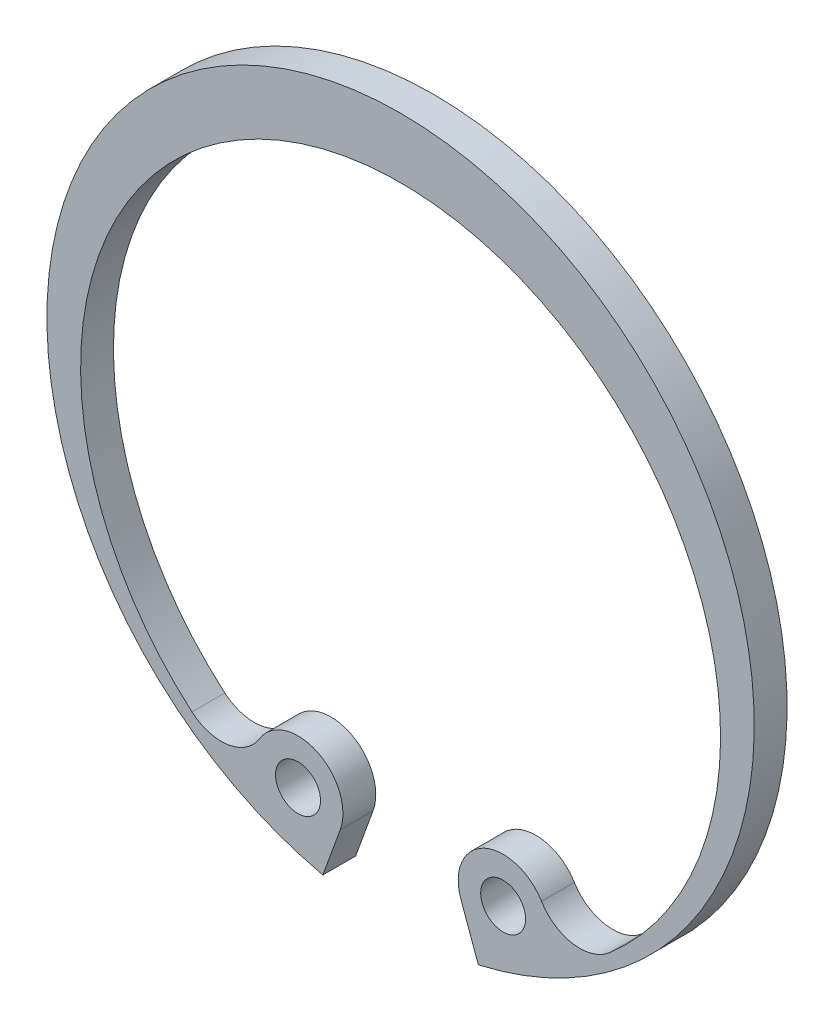
ISO-10303-21;
HEADER;
FILE_DESCRIPTION(('STEP AP214'),'2;1');
FILE_NAME('part.step','',(''),(''),'','','');
FILE_SCHEMA(('AUTOMOTIVE_DESIGN { 1 0 10303 214 1 1 1 1 }'));
ENDSEC;
DATA;
#1=APPLICATION_CONTEXT('core data for automotive mechanical design processes');
#2=APPLICATION_PROTOCOL_DEFINITION('international standard','automotive_design',2000,#1);
#3=PRODUCT_CONTEXT('',#1,'mechanical');
#4=PRODUCT('Part','Part','',(#3));
#5=PRODUCT_RELATED_PRODUCT_CATEGORY('part','',(#4));
#6=PRODUCT_DEFINITION_FORMATION('','',#4);
#7=PRODUCT_DEFINITION_CONTEXT('part definition',#1,'design');
#8=PRODUCT_DEFINITION('design','',#6,#7);
#9=PRODUCT_DEFINITION_SHAPE('','',#8);
#10=(LENGTH_UNIT() NAMED_UNIT(*) SI_UNIT(.MILLI.,.METRE.));
#11=(NAMED_UNIT(*) PLANE_ANGLE_UNIT() SI_UNIT($,.RADIAN.));
#12=(NAMED_UNIT(*) SI_UNIT($,.STERADIAN.) SOLID_ANGLE_UNIT());
#13=UNCERTAINTY_MEASURE_WITH_UNIT(LENGTH_MEASURE(1.E-05),#10,'distance_accuracy_value','');
#14=(GEOMETRIC_REPRESENTATION_CONTEXT(3) GLOBAL_UNCERTAINTY_ASSIGNED_CONTEXT((#13)) GLOBAL_UNIT_ASSIGNED_CONTEXT((#10,
#11,#12)) REPRESENTATION_CONTEXT('',''));
#15=CARTESIAN_POINT('',(0.,0.,0.));
#16=DIRECTION('',(0.,0.,1.));
#17=DIRECTION('',(1.,0.,0.));
#18=AXIS2_PLACEMENT_3D('',#15,#16,#17);
#19=CARTESIAN_POINT('',(0.,0.,0.975));
#20=DIRECTION('',(0.,0.,-1.));
#21=DIRECTION('',(-1.,0.,0.));
#22=AXIS2_PLACEMENT_3D('',#19,#20,#21);
#23=CYLINDRICAL_SURFACE('',#22,10.5);
#24=CARTESIAN_POINT('',(0.,0.,0.975));
#25=DIRECTION('',(0.,0.,-1.));
#26=DIRECTION('',(-1.,0.,0.));
#27=AXIS2_PLACEMENT_3D('',#24,#25,#26);
#28=CIRCLE('',#27,10.5);
#29=CARTESIAN_POINT('',(-2.30921625274565,-10.2429253779404,0.975));
#30=VERTEX_POINT('',#29);
#31=CARTESIAN_POINT('',(2.30921625274565,-10.2429253779404,0.975));
#32=VERTEX_POINT('',#31);
#33=EDGE_CURVE('E49',#30,#32,#28,.T.);
#34=ORIENTED_EDGE('',*,*,#33,.F.);
#35=DIRECTION('',(0.,0.,-1.));
#36=VECTOR('',#35,1.);
#37=CARTESIAN_POINT('',(-2.30921625274565,-10.2429253779404,1.95));
#38=LINE('',#37,#36);
#39=CARTESIAN_POINT('',(-2.30921625274565,-10.2429253779404,1.95));
#40=VERTEX_POINT('',#39);
#41=EDGE_CURVE('E11',#40,#30,#38,.T.);
#42=ORIENTED_EDGE('',*,*,#41,.F.);
#43=CARTESIAN_POINT('',(0.,0.,1.95));
#44=DIRECTION('',(0.,0.,1.));
#45=DIRECTION('',(1.,0.,0.));
#46=AXIS2_PLACEMENT_3D('',#43,#44,#45);
#47=CIRCLE('',#46,10.5);
#48=CARTESIAN_POINT('',(2.30921625274565,-10.2429253779404,1.95));
#49=VERTEX_POINT('',#48);
#50=EDGE_CURVE('E118',#49,#40,#47,.T.);
#51=ORIENTED_EDGE('',*,*,#50,.F.);
#52=DIRECTION('',(0.,0.,-1.));
#53=VECTOR('',#52,1.);
#54=CARTESIAN_POINT('',(2.30921625274565,-10.2429253779404,1.95));
#55=LINE('',#54,#53);
#56=EDGE_CURVE('E111',#49,#32,#55,.T.);
#57=ORIENTED_EDGE('',*,*,#56,.T.);
#58=EDGE_LOOP('',(#34,#42,#51,#57));
#59=FACE_BOUND('',#58,.T.);
#60=ADVANCED_FACE('F33',(#59),#23,.T.);
#61=CARTESIAN_POINT('',(0.,0.,1.95));
#62=DIRECTION('',(0.,0.,1.));
#63=DIRECTION('',(1.,0.,0.));
#64=AXIS2_PLACEMENT_3D('',#61,#62,#63);
#65=PLANE('',#64);
#66=CARTESIAN_POINT('',(3.04471087596214,-8.36527438047387,1.95));
#67=DIRECTION('',(0.,0.,1.));
#68=DIRECTION('',(1.,0.,0.));
#69=AXIS2_PLACEMENT_3D('',#66,#67,#68);
#70=CIRCLE('',#69,0.666666666666667);
#71=CARTESIAN_POINT('',(3.71137754262881,-8.36527438047387,1.95));
#72=VERTEX_POINT('',#71);
#73=EDGE_CURVE('E105',#72,#72,#70,.T.);
#74=ORIENTED_EDGE('',*,*,#73,.F.);
#75=EDGE_LOOP('',(#74));
#76=FACE_BOUND('',#75,.T.);
#77=ORIENTED_EDGE('',*,*,#50,.T.);
#78=DIRECTION('',(0.342020143325669,0.939692620785908,0.));
#79=VECTOR('',#78,1.);
#80=CARTESIAN_POINT('',(-1.79178738158093,-8.82130123824143,1.95));
#81=LINE('',#80,#79);
#82=CARTESIAN_POINT('',(-1.79178738158093,-8.82130123824143,1.95));
#83=VERTEX_POINT('',#82);
#84=EDGE_CURVE('E115',#40,#83,#81,.T.);
#85=ORIENTED_EDGE('',*,*,#84,.T.);
#86=CARTESIAN_POINT('',(-3.04471087596214,-8.36527438047387,1.95));
#87=DIRECTION('',(0.,0.,1.));
#88=DIRECTION('',(1.,0.,0.));
#89=AXIS2_PLACEMENT_3D('',#86,#87,#88);
#90=CIRCLE('',#89,1.33333333333333);
#91=CARTESIAN_POINT('',(-4.18415582842588,-7.67285617008172,1.95));
#92=VERTEX_POINT('',#91);
#93=EDGE_CURVE('E117',#83,#92,#90,.T.);
#94=ORIENTED_EDGE('',*,*,#93,.T.);
#95=CARTESIAN_POINT('',(-5.32360078088962,-6.98043795968956,1.95));
#96=DIRECTION('',(0.,0.,-1.));
#97=DIRECTION('',(1.,0.,0.));
#98=AXIS2_PLACEMENT_3D('',#95,#96,#97);
#99=CIRCLE('',#98,1.33333333333333);
#100=CARTESIAN_POINT('',(-6.19276009205528,-7.99154619800622,1.95));
#101=VERTEX_POINT('',#100);
#102=EDGE_CURVE('E130',#92,#101,#99,.T.);
#103=ORIENTED_EDGE('',*,*,#102,.T.);
#104=CARTESIAN_POINT('',(0.,-0.7874,1.95));
#105=DIRECTION('',(0.,0.,-1.));
#106=DIRECTION('',(1.,0.,0.));
#107=AXIS2_PLACEMENT_3D('',#104,#105,#106);
#108=CIRCLE('',#107,9.5);
#109=CARTESIAN_POINT('',(6.19276009205528,-7.99154619800622,1.95));
#110=VERTEX_POINT('',#109);
#111=EDGE_CURVE('E132',#101,#110,#108,.T.);
#112=ORIENTED_EDGE('',*,*,#111,.T.);
#113=CARTESIAN_POINT('',(5.32360078088963,-6.98043795968956,1.95));
#114=DIRECTION('',(0.,0.,-1.));
#115=DIRECTION('',(-1.,0.,0.));
#116=AXIS2_PLACEMENT_3D('',#113,#114,#115);
#117=CIRCLE('',#116,1.33333333333333);
#118=CARTESIAN_POINT('',(4.18415582842589,-7.67285617008171,1.95));
#119=VERTEX_POINT('',#118);
#120=EDGE_CURVE('E134',#110,#119,#117,.T.);
#121=ORIENTED_EDGE('',*,*,#120,.T.);
#122=CARTESIAN_POINT('',(3.04471087596214,-8.36527438047387,1.95));
#123=DIRECTION('',(0.,0.,1.));
#124=DIRECTION('',(-1.,0.,0.));
#125=AXIS2_PLACEMENT_3D('',#122,#123,#124);
#126=CIRCLE('',#125,1.33333333333333);
#127=CARTESIAN_POINT('',(1.79178738158093,-8.82130123824143,1.95));
#128=VERTEX_POINT('',#127);
#129=EDGE_CURVE('E136',#119,#128,#126,.T.);
#130=ORIENTED_EDGE('',*,*,#129,.T.);
#131=DIRECTION('',(0.34202014332567,-0.939692620785908,0.));
#132=VECTOR('',#131,1.);
#133=CARTESIAN_POINT('',(1.79178738158093,-8.82130123824143,1.95));
#134=LINE('',#133,#132);
#135=EDGE_CURVE('E57',#128,#49,#134,.T.);
#136=ORIENTED_EDGE('',*,*,#135,.T.);
#137=EDGE_LOOP('',(#77,#85,#94,#103,#112,#121,#130,#136));
#138=FACE_BOUND('',#137,.T.);
#139=CARTESIAN_POINT('',(-3.04471087596214,-8.36527438047387,1.95));
#140=DIRECTION('',(0.,0.,1.));
#141=DIRECTION('',(1.,0.,0.));
#142=AXIS2_PLACEMENT_3D('',#139,#140,#141);
#143=CIRCLE('',#142,0.666666666666667);
#144=CARTESIAN_POINT('',(-2.37804420929548,-8.36527438047387,1.95));
#145=VERTEX_POINT('',#144);
#146=EDGE_CURVE('E229',#145,#145,#143,.T.);
#147=ORIENTED_EDGE('',*,*,#146,.F.);
#148=EDGE_LOOP('',(#147));
#149=FACE_BOUND('',#148,.T.);
#150=ADVANCED_FACE('F120',(#76,#138,#149),#65,.T.);
#151=CARTESIAN_POINT('',(-1.79178738158093,-8.82130123824143,1.95));
#152=DIRECTION('',(-0.939692620785908,0.342020143325669,0.));
#153=DIRECTION('',(-0.342020143325669,-0.939692620785908,0.));
#154=AXIS2_PLACEMENT_3D('',#151,#152,#153);
#155=PLANE('',#154);
#156=DIRECTION('',(0.342020143325669,0.939692620785908,0.));
#157=VECTOR('',#156,1.);
#158=CARTESIAN_POINT('',(-1.79178738158093,-8.82130123824143,0.975));
#159=LINE('',#158,#157);
#160=CARTESIAN_POINT('',(-1.79178738158093,-8.82130123824143,0.975));
#161=VERTEX_POINT('',#160);
#162=EDGE_CURVE('E98',#30,#161,#159,.T.);
#163=ORIENTED_EDGE('',*,*,#162,.T.);
#164=DIRECTION('',(0.,0.,-1.));
#165=VECTOR('',#164,1.);
#166=CARTESIAN_POINT('',(-1.79178738158093,-8.82130123824143,1.95));
#167=LINE('',#166,#165);
#168=EDGE_CURVE('E41',#83,#161,#167,.T.);
#169=ORIENTED_EDGE('',*,*,#168,.F.);
#170=ORIENTED_EDGE('',*,*,#84,.F.);
#171=ORIENTED_EDGE('',*,*,#41,.T.);
#172=EDGE_LOOP('',(#163,#169,#170,#171));
#173=FACE_BOUND('',#172,.T.);
#174=ADVANCED_FACE('F114',(#173),#155,.F.);
#175=CARTESIAN_POINT('',(-3.04471087596214,-8.36527438047387,1.95));
#176=DIRECTION('',(0.,0.,-1.));
#177=DIRECTION('',(-1.,0.,0.));
#178=AXIS2_PLACEMENT_3D('',#175,#176,#177);
#179=CYLINDRICAL_SURFACE('',#178,1.33333333333333);
#180=CARTESIAN_POINT('',(-3.04471087596214,-8.36527438047387,0.975));
#181=DIRECTION('',(0.,0.,1.));
#182=DIRECTION('',(1.,0.,0.));
#183=AXIS2_PLACEMENT_3D('',#180,#181,#182);
#184=CIRCLE('',#183,1.33333333333333);
#185=CARTESIAN_POINT('',(-4.18415582842588,-7.67285617008172,0.975));
#186=VERTEX_POINT('',#185);
#187=EDGE_CURVE('E101',#161,#186,#184,.T.);
#188=ORIENTED_EDGE('',*,*,#187,.T.);
#189=DIRECTION('',(0.,0.,-1.));
#190=VECTOR('',#189,1.);
#191=CARTESIAN_POINT('',(-4.18415582842588,-7.67285617008172,1.95));
#192=LINE('',#191,#190);
#193=EDGE_CURVE('E172',#92,#186,#192,.T.);
#194=ORIENTED_EDGE('',*,*,#193,.F.);
#195=ORIENTED_EDGE('',*,*,#93,.F.);
#196=ORIENTED_EDGE('',*,*,#168,.T.);
#197=EDGE_LOOP('',(#188,#194,#195,#196));
#198=FACE_BOUND('',#197,.T.);
#199=ADVANCED_FACE('F178',(#198),#179,.T.);
#200=CARTESIAN_POINT('',(-5.32360078088962,-6.98043795968956,1.95));
#201=DIRECTION('',(0.,0.,-1.));
#202=DIRECTION('',(-1.,0.,0.));
#203=AXIS2_PLACEMENT_3D('',#200,#201,#202);
#204=CYLINDRICAL_SURFACE('',#203,1.33333333333333);
#205=CARTESIAN_POINT('',(-5.32360078088962,-6.98043795968956,0.975));
#206=DIRECTION('',(0.,0.,-1.));
#207=DIRECTION('',(1.,0.,0.));
#208=AXIS2_PLACEMENT_3D('',#205,#206,#207);
#209=CIRCLE('',#208,1.33333333333333);
#210=CARTESIAN_POINT('',(-6.19276009205528,-7.99154619800622,0.975));
#211=VERTEX_POINT('',#210);
#212=EDGE_CURVE('E140',#186,#211,#209,.T.);
#213=ORIENTED_EDGE('',*,*,#212,.T.);
#214=DIRECTION('',(0.,0.,-1.));
#215=VECTOR('',#214,1.);
#216=CARTESIAN_POINT('',(-6.19276009205528,-7.99154619800622,1.95));
#217=LINE('',#216,#215);
#218=EDGE_CURVE('E167',#101,#211,#217,.T.);
#219=ORIENTED_EDGE('',*,*,#218,.F.);
#220=ORIENTED_EDGE('',*,*,#102,.F.);
#221=ORIENTED_EDGE('',*,*,#193,.T.);
#222=EDGE_LOOP('',(#213,#219,#220,#221));
#223=FACE_BOUND('',#222,.T.);
#224=ADVANCED_FACE('F185',(#223),#204,.F.);
#225=CARTESIAN_POINT('',(0.,-0.7874,1.95));
#226=DIRECTION('',(0.,0.,-1.));
#227=DIRECTION('',(-1.,0.,0.));
#228=AXIS2_PLACEMENT_3D('',#225,#226,#227);
#229=CYLINDRICAL_SURFACE('',#228,9.5);
#230=CARTESIAN_POINT('',(0.,-0.7874,0.975));
#231=DIRECTION('',(0.,0.,-1.));
#232=DIRECTION('',(1.,0.,0.));
#233=AXIS2_PLACEMENT_3D('',#230,#231,#232);
#234=CIRCLE('',#233,9.5);
#235=CARTESIAN_POINT('',(6.19276009205528,-7.99154619800622,0.975));
#236=VERTEX_POINT('',#235);
#237=EDGE_CURVE('E143',#211,#236,#234,.T.);
#238=ORIENTED_EDGE('',*,*,#237,.T.);
#239=DIRECTION('',(0.,0.,-1.));
#240=VECTOR('',#239,1.);
#241=CARTESIAN_POINT('',(6.19276009205528,-7.99154619800622,1.95));
#242=LINE('',#241,#240);
#243=EDGE_CURVE('E162',#110,#236,#242,.T.);
#244=ORIENTED_EDGE('',*,*,#243,.F.);
#245=ORIENTED_EDGE('',*,*,#111,.F.);
#246=ORIENTED_EDGE('',*,*,#218,.T.);
#247=EDGE_LOOP('',(#238,#244,#245,#246));
#248=FACE_BOUND('',#247,.T.);
#249=ADVANCED_FACE('F187',(#248),#229,.F.);
#250=CARTESIAN_POINT('',(5.32360078088963,-6.98043795968956,1.95));
#251=DIRECTION('',(0.,0.,-1.));
#252=DIRECTION('',(-1.,0.,0.));
#253=AXIS2_PLACEMENT_3D('',#250,#251,#252);
#254=CYLINDRICAL_SURFACE('',#253,1.33333333333333);
#255=CARTESIAN_POINT('',(5.32360078088963,-6.98043795968956,0.975));
#256=DIRECTION('',(0.,0.,-1.));
#257=DIRECTION('',(-1.,0.,0.));
#258=AXIS2_PLACEMENT_3D('',#255,#256,#257);
#259=CIRCLE('',#258,1.33333333333333);
#260=CARTESIAN_POINT('',(4.18415582842589,-7.67285617008171,0.975));
#261=VERTEX_POINT('',#260);
#262=EDGE_CURVE('E146',#236,#261,#259,.T.);
#263=ORIENTED_EDGE('',*,*,#262,.T.);
#264=DIRECTION('',(0.,0.,-1.));
#265=VECTOR('',#264,1.);
#266=CARTESIAN_POINT('',(4.18415582842589,-7.67285617008171,1.95));
#267=LINE('',#266,#265);
#268=EDGE_CURVE('E158',#119,#261,#267,.T.);
#269=ORIENTED_EDGE('',*,*,#268,.F.);
#270=ORIENTED_EDGE('',*,*,#120,.F.);
#271=ORIENTED_EDGE('',*,*,#243,.T.);
#272=EDGE_LOOP('',(#263,#269,#270,#271));
#273=FACE_BOUND('',#272,.T.);
#274=ADVANCED_FACE('F190',(#273),#254,.F.);
#275=CARTESIAN_POINT('',(3.04471087596214,-8.36527438047387,1.95));
#276=DIRECTION('',(0.,0.,-1.));
#277=DIRECTION('',(-1.,0.,0.));
#278=AXIS2_PLACEMENT_3D('',#275,#276,#277);
#279=CYLINDRICAL_SURFACE('',#278,1.33333333333333);
#280=CARTESIAN_POINT('',(3.04471087596214,-8.36527438047387,0.975));
#281=DIRECTION('',(0.,0.,1.));
#282=DIRECTION('',(-1.,0.,0.));
#283=AXIS2_PLACEMENT_3D('',#280,#281,#282);
#284=CIRCLE('',#283,1.33333333333333);
#285=CARTESIAN_POINT('',(1.79178738158093,-8.82130123824143,0.975));
#286=VERTEX_POINT('',#285);
#287=EDGE_CURVE('E124',#261,#286,#284,.T.);
#288=ORIENTED_EDGE('',*,*,#287,.T.);
#289=DIRECTION('',(0.,0.,-1.));
#290=VECTOR('',#289,1.);
#291=CARTESIAN_POINT('',(1.79178738158093,-8.82130123824143,1.95));
#292=LINE('',#291,#290);
#293=EDGE_CURVE('E153',#128,#286,#292,.T.);
#294=ORIENTED_EDGE('',*,*,#293,.F.);
#295=ORIENTED_EDGE('',*,*,#129,.F.);
#296=ORIENTED_EDGE('',*,*,#268,.T.);
#297=EDGE_LOOP('',(#288,#294,#295,#296));
#298=FACE_BOUND('',#297,.T.);
#299=ADVANCED_FACE('F191',(#298),#279,.T.);
#300=CARTESIAN_POINT('',(1.79178738158093,-8.82130123824143,1.95));
#301=DIRECTION('',(0.939692620785908,0.34202014332567,0.));
#302=DIRECTION('',(-0.34202014332567,0.939692620785908,0.));
#303=AXIS2_PLACEMENT_3D('',#300,#301,#302);
#304=PLANE('',#303);
#305=DIRECTION('',(0.34202014332567,-0.939692620785908,0.));
#306=VECTOR('',#305,1.);
#307=CARTESIAN_POINT('',(1.79178738158093,-8.82130123824143,0.975));
#308=LINE('',#307,#306);
#309=EDGE_CURVE('E122',#286,#32,#308,.T.);
#310=ORIENTED_EDGE('',*,*,#309,.T.);
#311=ORIENTED_EDGE('',*,*,#56,.F.);
#312=ORIENTED_EDGE('',*,*,#135,.F.);
#313=ORIENTED_EDGE('',*,*,#293,.T.);
#314=EDGE_LOOP('',(#310,#311,#312,#313));
#315=FACE_BOUND('',#314,.T.);
#316=ADVANCED_FACE('F192',(#315),#304,.F.);
#317=CARTESIAN_POINT('',(3.04471087596214,-8.36527438047387,1.95));
#318=DIRECTION('',(0.,0.,-1.));
#319=DIRECTION('',(-1.,0.,0.));
#320=AXIS2_PLACEMENT_3D('',#317,#318,#319);
#321=CYLINDRICAL_SURFACE('',#320,0.666666666666667);
#322=ORIENTED_EDGE('',*,*,#73,.T.);
#323=EDGE_LOOP('',(#322));
#324=FACE_BOUND('',#323,.T.);
#325=CARTESIAN_POINT('',(3.04471087596214,-8.36527438047387,0.975));
#326=DIRECTION('',(0.,0.,-1.));
#327=DIRECTION('',(-1.,0.,0.));
#328=AXIS2_PLACEMENT_3D('',#325,#326,#327);
#329=CIRCLE('',#328,0.666666666666667);
#330=CARTESIAN_POINT('',(2.37804420929548,-8.36527438047387,0.975));
#331=VERTEX_POINT('',#330);
#332=EDGE_CURVE('E227',#331,#331,#329,.T.);
#333=ORIENTED_EDGE('',*,*,#332,.T.);
#334=EDGE_LOOP('',(#333));
#335=FACE_BOUND('',#334,.T.);
#336=ADVANCED_FACE('F194',(#324,#335),#321,.F.);
#337=CARTESIAN_POINT('',(-3.04471087596214,-8.36527438047387,1.95));
#338=DIRECTION('',(0.,0.,-1.));
#339=DIRECTION('',(-1.,0.,0.));
#340=AXIS2_PLACEMENT_3D('',#337,#338,#339);
#341=CYLINDRICAL_SURFACE('',#340,0.666666666666667);
#342=ORIENTED_EDGE('',*,*,#146,.T.);
#343=EDGE_LOOP('',(#342));
#344=FACE_BOUND('',#343,.T.);
#345=CARTESIAN_POINT('',(-3.04471087596214,-8.36527438047387,0.975));
#346=DIRECTION('',(0.,0.,-1.));
#347=DIRECTION('',(-1.,0.,0.));
#348=AXIS2_PLACEMENT_3D('',#345,#346,#347);
#349=CIRCLE('',#348,0.666666666666667);
#350=CARTESIAN_POINT('',(-3.71137754262881,-8.36527438047387,0.975));
#351=VERTEX_POINT('',#350);
#352=EDGE_CURVE('E112',#351,#351,#349,.T.);
#353=ORIENTED_EDGE('',*,*,#352,.T.);
#354=EDGE_LOOP('',(#353));
#355=FACE_BOUND('',#354,.T.);
#356=ADVANCED_FACE('F200',(#344,#355),#341,.F.);
#357=CARTESIAN_POINT('',(0.,0.,0.975));
#358=DIRECTION('',(0.,0.,-1.));
#359=DIRECTION('',(-1.,0.,0.));
#360=AXIS2_PLACEMENT_3D('',#357,#358,#359);
#361=PLANE('',#360);
#362=ORIENTED_EDGE('',*,*,#352,.F.);
#363=EDGE_LOOP('',(#362));
#364=FACE_BOUND('',#363,.T.);
#365=ORIENTED_EDGE('',*,*,#332,.F.);
#366=EDGE_LOOP('',(#365));
#367=FACE_BOUND('',#366,.T.);
#368=ORIENTED_EDGE('',*,*,#162,.F.);
#369=ORIENTED_EDGE('',*,*,#33,.T.);
#370=ORIENTED_EDGE('',*,*,#309,.F.);
#371=ORIENTED_EDGE('',*,*,#287,.F.);
#372=ORIENTED_EDGE('',*,*,#262,.F.);
#373=ORIENTED_EDGE('',*,*,#237,.F.);
#374=ORIENTED_EDGE('',*,*,#212,.F.);
#375=ORIENTED_EDGE('',*,*,#187,.F.);
#376=EDGE_LOOP('',(#368,#369,#370,#371,#372,#373,#374,#375));
#377=FACE_BOUND('',#376,.T.);
#378=ADVANCED_FACE('F99',(#364,#367,#377),#361,.T.);
#379=CLOSED_SHELL('',(#60,#150,#174,#199,#224,#249,#274,#299,#316,#336,#356,#378));
#380=MANIFOLD_SOLID_BREP('B2',#379);
#381=ADVANCED_BREP_SHAPE_REPRESENTATION('',(#18,#380),#14);
#382=SHAPE_DEFINITION_REPRESENTATION(#9,#381);
ENDSEC;
END-ISO-10303-21;
